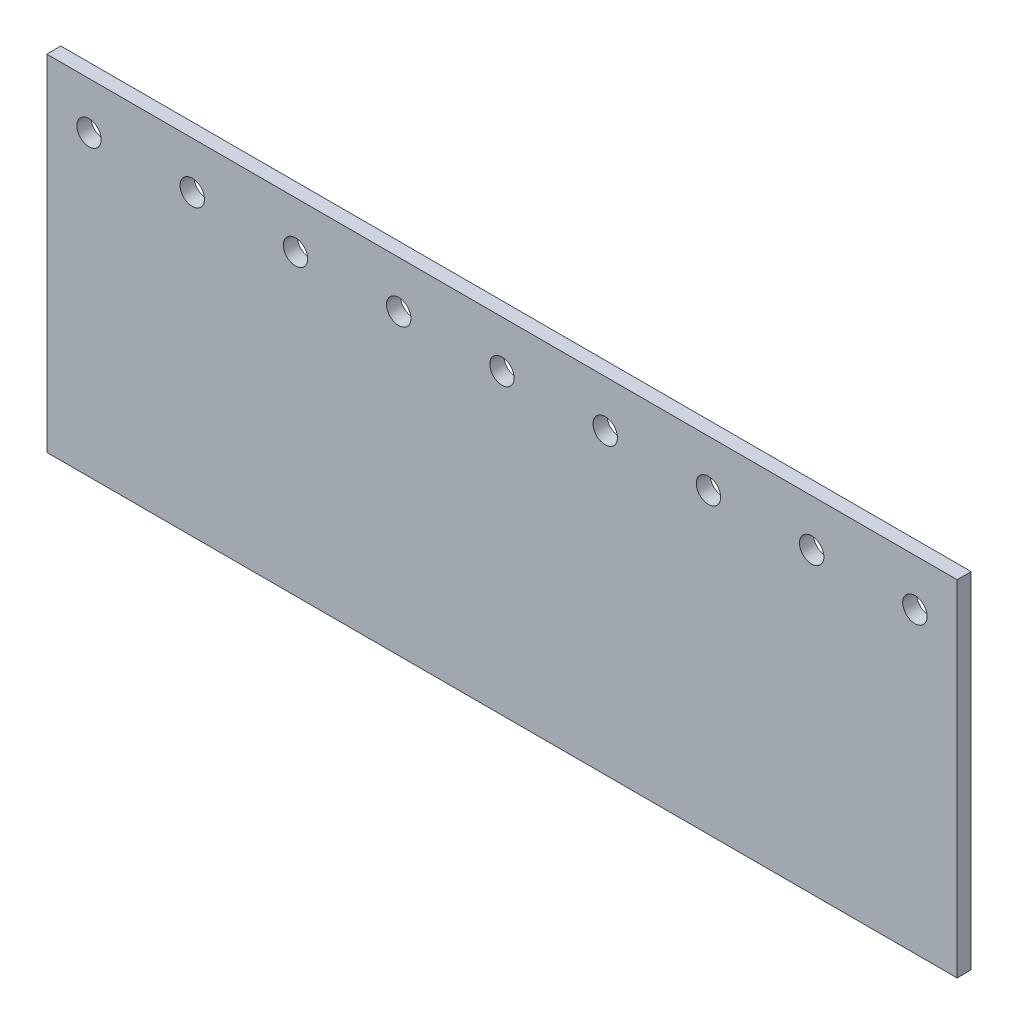
ISO-10303-21;
HEADER;
FILE_DESCRIPTION(('STEP AP214'),'2;1');
FILE_NAME('part.step','',(''),(''),'','','');
FILE_SCHEMA(('AUTOMOTIVE_DESIGN { 1 0 10303 214 1 1 1 1 }'));
ENDSEC;
DATA;
#1=APPLICATION_CONTEXT('core data for automotive mechanical design processes');
#2=APPLICATION_PROTOCOL_DEFINITION('international standard','automotive_design',2000,#1);
#3=PRODUCT_CONTEXT('',#1,'mechanical');
#4=PRODUCT('Part','Part','',(#3));
#5=PRODUCT_RELATED_PRODUCT_CATEGORY('part','',(#4));
#6=PRODUCT_DEFINITION_FORMATION('','',#4);
#7=PRODUCT_DEFINITION_CONTEXT('part definition',#1,'design');
#8=PRODUCT_DEFINITION('design','',#6,#7);
#9=PRODUCT_DEFINITION_SHAPE('','',#8);
#10=(LENGTH_UNIT() NAMED_UNIT(*) SI_UNIT(.MILLI.,.METRE.));
#11=(NAMED_UNIT(*) PLANE_ANGLE_UNIT() SI_UNIT($,.RADIAN.));
#12=(NAMED_UNIT(*) SI_UNIT($,.STERADIAN.) SOLID_ANGLE_UNIT());
#13=UNCERTAINTY_MEASURE_WITH_UNIT(LENGTH_MEASURE(1.E-05),#10,'distance_accuracy_value','');
#14=(GEOMETRIC_REPRESENTATION_CONTEXT(3) GLOBAL_UNCERTAINTY_ASSIGNED_CONTEXT((#13)) GLOBAL_UNIT_ASSIGNED_CONTEXT((#10,
#11,#12)) REPRESENTATION_CONTEXT('',''));
#15=CARTESIAN_POINT('',(0.,0.,0.));
#16=DIRECTION('',(0.,0.,1.));
#17=DIRECTION('',(1.,0.,0.));
#18=AXIS2_PLACEMENT_3D('',#15,#16,#17);
#19=CARTESIAN_POINT('',(-100.,36.75,3.));
#20=DIRECTION('',(0.,-1.,0.));
#21=DIRECTION('',(0.,0.,-1.));
#22=AXIS2_PLACEMENT_3D('',#19,#20,#21);
#23=PLANE('',#22);
#24=DIRECTION('',(-1.,0.,0.));
#25=VECTOR('',#24,1.);
#26=CARTESIAN_POINT('',(-100.,36.75,0.));
#27=LINE('',#26,#25);
#28=CARTESIAN_POINT('',(97.,36.75,0.));
#29=VERTEX_POINT('',#28);
#30=CARTESIAN_POINT('',(-97.,36.75,0.));
#31=VERTEX_POINT('',#30);
#32=EDGE_CURVE('E94',#29,#31,#27,.T.);
#33=ORIENTED_EDGE('',*,*,#32,.T.);
#34=DIRECTION('',(0.,0.,1.));
#35=VECTOR('',#34,1.);
#36=CARTESIAN_POINT('',(-97.,36.75,0.));
#37=LINE('',#36,#35);
#38=CARTESIAN_POINT('',(-97.,36.75,3.));
#39=VERTEX_POINT('',#38);
#40=EDGE_CURVE('E54',#31,#39,#37,.T.);
#41=ORIENTED_EDGE('',*,*,#40,.T.);
#42=DIRECTION('',(-1.,0.,0.));
#43=VECTOR('',#42,1.);
#44=CARTESIAN_POINT('',(-100.,36.75,3.));
#45=LINE('',#44,#43);
#46=CARTESIAN_POINT('',(97.,36.75,3.));
#47=VERTEX_POINT('',#46);
#48=EDGE_CURVE('E46',#47,#39,#45,.T.);
#49=ORIENTED_EDGE('',*,*,#48,.F.);
#50=DIRECTION('',(0.,0.,1.));
#51=VECTOR('',#50,1.);
#52=CARTESIAN_POINT('',(97.,36.75,0.));
#53=LINE('',#52,#51);
#54=EDGE_CURVE('E158',#29,#47,#53,.T.);
#55=ORIENTED_EDGE('',*,*,#54,.F.);
#56=EDGE_LOOP('',(#33,#41,#49,#55));
#57=FACE_BOUND('',#56,.T.);
#58=ADVANCED_FACE('F38',(#57),#23,.F.);
#59=CARTESIAN_POINT('',(-100.,-36.75,3.));
#60=DIRECTION('',(0.,1.,0.));
#61=DIRECTION('',(0.,0.,1.));
#62=AXIS2_PLACEMENT_3D('',#59,#60,#61);
#63=PLANE('',#62);
#64=DIRECTION('',(1.,0.,0.));
#65=VECTOR('',#64,1.);
#66=CARTESIAN_POINT('',(-100.,-36.75,3.));
#67=LINE('',#66,#65);
#68=CARTESIAN_POINT('',(-97.,-36.75,3.));
#69=VERTEX_POINT('',#68);
#70=CARTESIAN_POINT('',(97.,-36.75,3.));
#71=VERTEX_POINT('',#70);
#72=EDGE_CURVE('E11',#69,#71,#67,.T.);
#73=ORIENTED_EDGE('',*,*,#72,.F.);
#74=DIRECTION('',(0.,0.,1.));
#75=VECTOR('',#74,1.);
#76=CARTESIAN_POINT('',(-97.,-36.75,0.));
#77=LINE('',#76,#75);
#78=CARTESIAN_POINT('',(-97.,-36.75,0.));
#79=VERTEX_POINT('',#78);
#80=EDGE_CURVE('E80',#79,#69,#77,.T.);
#81=ORIENTED_EDGE('',*,*,#80,.F.);
#82=DIRECTION('',(1.,0.,0.));
#83=VECTOR('',#82,1.);
#84=CARTESIAN_POINT('',(-100.,-36.75,0.));
#85=LINE('',#84,#83);
#86=CARTESIAN_POINT('',(97.,-36.75,0.));
#87=VERTEX_POINT('',#86);
#88=EDGE_CURVE('E41',#79,#87,#85,.T.);
#89=ORIENTED_EDGE('',*,*,#88,.T.);
#90=DIRECTION('',(0.,0.,1.));
#91=VECTOR('',#90,1.);
#92=CARTESIAN_POINT('',(97.,-36.75,0.));
#93=LINE('',#92,#91);
#94=EDGE_CURVE('E62',#87,#71,#93,.T.);
#95=ORIENTED_EDGE('',*,*,#94,.T.);
#96=EDGE_LOOP('',(#73,#81,#89,#95));
#97=FACE_BOUND('',#96,.T.);
#98=ADVANCED_FACE('F90',(#97),#63,.F.);
#99=CARTESIAN_POINT('',(0.,0.,3.));
#100=DIRECTION('',(0.,0.,1.));
#101=DIRECTION('',(1.,0.,0.));
#102=AXIS2_PLACEMENT_3D('',#99,#100,#101);
#103=PLANE('',#102);
#104=DIRECTION('',(0.,1.,0.));
#105=VECTOR('',#104,1.);
#106=CARTESIAN_POINT('',(-97.,0.,3.));
#107=LINE('',#106,#105);
#108=EDGE_CURVE('E144',#69,#39,#107,.T.);
#109=ORIENTED_EDGE('',*,*,#108,.F.);
#110=ORIENTED_EDGE('',*,*,#72,.T.);
#111=DIRECTION('',(0.,-1.,0.));
#112=VECTOR('',#111,1.);
#113=CARTESIAN_POINT('',(97.,0.,3.));
#114=LINE('',#113,#112);
#115=EDGE_CURVE('E156',#47,#71,#114,.T.);
#116=ORIENTED_EDGE('',*,*,#115,.F.);
#117=ORIENTED_EDGE('',*,*,#48,.T.);
#118=EDGE_LOOP('',(#109,#110,#116,#117));
#119=FACE_BOUND('',#118,.T.);
#120=CARTESIAN_POINT('',(-22.,26.75,3.));
#121=DIRECTION('',(0.,0.,1.));
#122=DIRECTION('',(1.,0.,0.));
#123=AXIS2_PLACEMENT_3D('',#120,#121,#122);
#124=CIRCLE('',#123,2.6);
#125=CARTESIAN_POINT('',(-19.4,26.75,3.));
#126=VERTEX_POINT('',#125);
#127=EDGE_CURVE('E129',#126,#126,#124,.T.);
#128=ORIENTED_EDGE('',*,*,#127,.F.);
#129=EDGE_LOOP('',(#128));
#130=FACE_BOUND('',#129,.T.);
#131=CARTESIAN_POINT('',(88.,26.75,3.));
#132=DIRECTION('',(0.,0.,1.));
#133=DIRECTION('',(1.,0.,0.));
#134=AXIS2_PLACEMENT_3D('',#131,#132,#133);
#135=CIRCLE('',#134,2.6);
#136=CARTESIAN_POINT('',(90.6,26.75,3.));
#137=VERTEX_POINT('',#136);
#138=EDGE_CURVE('E128',#137,#137,#135,.T.);
#139=ORIENTED_EDGE('',*,*,#138,.F.);
#140=EDGE_LOOP('',(#139));
#141=FACE_BOUND('',#140,.T.);
#142=CARTESIAN_POINT('',(66.,26.75,3.));
#143=DIRECTION('',(0.,0.,1.));
#144=DIRECTION('',(1.,0.,0.));
#145=AXIS2_PLACEMENT_3D('',#142,#143,#144);
#146=CIRCLE('',#145,2.6);
#147=CARTESIAN_POINT('',(68.6,26.75,3.));
#148=VERTEX_POINT('',#147);
#149=EDGE_CURVE('E117',#148,#148,#146,.T.);
#150=ORIENTED_EDGE('',*,*,#149,.F.);
#151=EDGE_LOOP('',(#150));
#152=FACE_BOUND('',#151,.T.);
#153=CARTESIAN_POINT('',(44.,26.75,3.));
#154=DIRECTION('',(0.,0.,1.));
#155=DIRECTION('',(1.,0.,0.));
#156=AXIS2_PLACEMENT_3D('',#153,#154,#155);
#157=CIRCLE('',#156,2.6);
#158=CARTESIAN_POINT('',(46.6,26.75,3.));
#159=VERTEX_POINT('',#158);
#160=EDGE_CURVE('E116',#159,#159,#157,.T.);
#161=ORIENTED_EDGE('',*,*,#160,.F.);
#162=EDGE_LOOP('',(#161));
#163=FACE_BOUND('',#162,.T.);
#164=CARTESIAN_POINT('',(-44.,26.75,3.));
#165=DIRECTION('',(0.,0.,1.));
#166=DIRECTION('',(1.,0.,0.));
#167=AXIS2_PLACEMENT_3D('',#164,#165,#166);
#168=CIRCLE('',#167,2.6);
#169=CARTESIAN_POINT('',(-41.4,26.75,3.));
#170=VERTEX_POINT('',#169);
#171=EDGE_CURVE('E148',#170,#170,#168,.T.);
#172=ORIENTED_EDGE('',*,*,#171,.F.);
#173=EDGE_LOOP('',(#172));
#174=FACE_BOUND('',#173,.T.);
#175=CARTESIAN_POINT('',(-66.,26.75,3.));
#176=DIRECTION('',(0.,0.,1.));
#177=DIRECTION('',(1.,0.,0.));
#178=AXIS2_PLACEMENT_3D('',#175,#176,#177);
#179=CIRCLE('',#178,2.6);
#180=CARTESIAN_POINT('',(-63.4,26.75,3.));
#181=VERTEX_POINT('',#180);
#182=EDGE_CURVE('E140',#181,#181,#179,.T.);
#183=ORIENTED_EDGE('',*,*,#182,.F.);
#184=EDGE_LOOP('',(#183));
#185=FACE_BOUND('',#184,.T.);
#186=CARTESIAN_POINT('',(-88.,26.75,3.));
#187=DIRECTION('',(0.,0.,1.));
#188=DIRECTION('',(1.,0.,0.));
#189=AXIS2_PLACEMENT_3D('',#186,#187,#188);
#190=CIRCLE('',#189,2.6);
#191=CARTESIAN_POINT('',(-85.4,26.75,3.));
#192=VERTEX_POINT('',#191);
#193=EDGE_CURVE('E141',#192,#192,#190,.T.);
#194=ORIENTED_EDGE('',*,*,#193,.F.);
#195=EDGE_LOOP('',(#194));
#196=FACE_BOUND('',#195,.T.);
#197=CARTESIAN_POINT('',(22.,26.75,3.));
#198=DIRECTION('',(0.,0.,1.));
#199=DIRECTION('',(1.,0.,0.));
#200=AXIS2_PLACEMENT_3D('',#197,#198,#199);
#201=CIRCLE('',#200,2.6);
#202=CARTESIAN_POINT('',(24.6,26.75,3.));
#203=VERTEX_POINT('',#202);
#204=EDGE_CURVE('E109',#203,#203,#201,.T.);
#205=ORIENTED_EDGE('',*,*,#204,.F.);
#206=EDGE_LOOP('',(#205));
#207=FACE_BOUND('',#206,.T.);
#208=CARTESIAN_POINT('',(0.,26.75,3.));
#209=DIRECTION('',(0.,0.,1.));
#210=DIRECTION('',(1.,0.,0.));
#211=AXIS2_PLACEMENT_3D('',#208,#209,#210);
#212=CIRCLE('',#211,2.6);
#213=CARTESIAN_POINT('',(2.59999999999997,26.75,3.));
#214=VERTEX_POINT('',#213);
#215=EDGE_CURVE('E97',#214,#214,#212,.T.);
#216=ORIENTED_EDGE('',*,*,#215,.F.);
#217=EDGE_LOOP('',(#216));
#218=FACE_BOUND('',#217,.T.);
#219=ADVANCED_FACE('F165',(#119,#130,#141,#152,#163,#174,#185,#196,#207,#218),#103,.T.);
#220=CARTESIAN_POINT('',(0.,0.,0.));
#221=DIRECTION('',(0.,0.,1.));
#222=DIRECTION('',(1.,0.,0.));
#223=AXIS2_PLACEMENT_3D('',#220,#221,#222);
#224=PLANE('',#223);
#225=CARTESIAN_POINT('',(-22.,26.75,0.));
#226=DIRECTION('',(0.,0.,1.));
#227=DIRECTION('',(1.,0.,0.));
#228=AXIS2_PLACEMENT_3D('',#225,#226,#227);
#229=CIRCLE('',#228,2.6);
#230=CARTESIAN_POINT('',(-19.4,26.75,0.));
#231=VERTEX_POINT('',#230);
#232=EDGE_CURVE('E125',#231,#231,#229,.T.);
#233=ORIENTED_EDGE('',*,*,#232,.T.);
#234=EDGE_LOOP('',(#233));
#235=FACE_BOUND('',#234,.T.);
#236=CARTESIAN_POINT('',(88.,26.75,0.));
#237=DIRECTION('',(0.,0.,1.));
#238=DIRECTION('',(1.,0.,0.));
#239=AXIS2_PLACEMENT_3D('',#236,#237,#238);
#240=CIRCLE('',#239,2.6);
#241=CARTESIAN_POINT('',(90.6,26.75,0.));
#242=VERTEX_POINT('',#241);
#243=EDGE_CURVE('E120',#242,#242,#240,.T.);
#244=ORIENTED_EDGE('',*,*,#243,.T.);
#245=EDGE_LOOP('',(#244));
#246=FACE_BOUND('',#245,.T.);
#247=CARTESIAN_POINT('',(66.,26.75,0.));
#248=DIRECTION('',(0.,0.,1.));
#249=DIRECTION('',(1.,0.,0.));
#250=AXIS2_PLACEMENT_3D('',#247,#248,#249);
#251=CIRCLE('',#250,2.6);
#252=CARTESIAN_POINT('',(68.6,26.75,0.));
#253=VERTEX_POINT('',#252);
#254=EDGE_CURVE('E113',#253,#253,#251,.T.);
#255=ORIENTED_EDGE('',*,*,#254,.T.);
#256=EDGE_LOOP('',(#255));
#257=FACE_BOUND('',#256,.T.);
#258=CARTESIAN_POINT('',(44.,26.75,0.));
#259=DIRECTION('',(0.,0.,1.));
#260=DIRECTION('',(1.,0.,0.));
#261=AXIS2_PLACEMENT_3D('',#258,#259,#260);
#262=CIRCLE('',#261,2.6);
#263=CARTESIAN_POINT('',(46.6,26.75,0.));
#264=VERTEX_POINT('',#263);
#265=EDGE_CURVE('E112',#264,#264,#262,.T.);
#266=ORIENTED_EDGE('',*,*,#265,.T.);
#267=EDGE_LOOP('',(#266));
#268=FACE_BOUND('',#267,.T.);
#269=CARTESIAN_POINT('',(-44.,26.75,0.));
#270=DIRECTION('',(0.,0.,1.));
#271=DIRECTION('',(1.,0.,0.));
#272=AXIS2_PLACEMENT_3D('',#269,#270,#271);
#273=CIRCLE('',#272,2.6);
#274=CARTESIAN_POINT('',(-41.4,26.75,0.));
#275=VERTEX_POINT('',#274);
#276=EDGE_CURVE('E132',#275,#275,#273,.T.);
#277=ORIENTED_EDGE('',*,*,#276,.T.);
#278=EDGE_LOOP('',(#277));
#279=FACE_BOUND('',#278,.T.);
#280=CARTESIAN_POINT('',(-66.,26.75,0.));
#281=DIRECTION('',(0.,0.,1.));
#282=DIRECTION('',(1.,0.,0.));
#283=AXIS2_PLACEMENT_3D('',#280,#281,#282);
#284=CIRCLE('',#283,2.6);
#285=CARTESIAN_POINT('',(-63.4,26.75,0.));
#286=VERTEX_POINT('',#285);
#287=EDGE_CURVE('E145',#286,#286,#284,.T.);
#288=ORIENTED_EDGE('',*,*,#287,.T.);
#289=EDGE_LOOP('',(#288));
#290=FACE_BOUND('',#289,.T.);
#291=CARTESIAN_POINT('',(-88.,26.75,0.));
#292=DIRECTION('',(0.,0.,1.));
#293=DIRECTION('',(1.,0.,0.));
#294=AXIS2_PLACEMENT_3D('',#291,#292,#293);
#295=CIRCLE('',#294,2.6);
#296=CARTESIAN_POINT('',(-85.4,26.75,0.));
#297=VERTEX_POINT('',#296);
#298=EDGE_CURVE('E137',#297,#297,#295,.T.);
#299=ORIENTED_EDGE('',*,*,#298,.T.);
#300=EDGE_LOOP('',(#299));
#301=FACE_BOUND('',#300,.T.);
#302=CARTESIAN_POINT('',(22.,26.75,0.));
#303=DIRECTION('',(0.,0.,1.));
#304=DIRECTION('',(1.,0.,0.));
#305=AXIS2_PLACEMENT_3D('',#302,#303,#304);
#306=CIRCLE('',#305,2.6);
#307=CARTESIAN_POINT('',(24.6,26.75,0.));
#308=VERTEX_POINT('',#307);
#309=EDGE_CURVE('E106',#308,#308,#306,.T.);
#310=ORIENTED_EDGE('',*,*,#309,.T.);
#311=EDGE_LOOP('',(#310));
#312=FACE_BOUND('',#311,.T.);
#313=CARTESIAN_POINT('',(0.,26.75,0.));
#314=DIRECTION('',(0.,0.,1.));
#315=DIRECTION('',(1.,0.,0.));
#316=AXIS2_PLACEMENT_3D('',#313,#314,#315);
#317=CIRCLE('',#316,2.6);
#318=CARTESIAN_POINT('',(2.59999999999997,26.75,0.));
#319=VERTEX_POINT('',#318);
#320=EDGE_CURVE('E101',#319,#319,#317,.T.);
#321=ORIENTED_EDGE('',*,*,#320,.T.);
#322=EDGE_LOOP('',(#321));
#323=FACE_BOUND('',#322,.T.);
#324=ORIENTED_EDGE('',*,*,#88,.F.);
#325=DIRECTION('',(0.,1.,0.));
#326=VECTOR('',#325,1.);
#327=CARTESIAN_POINT('',(-97.,36.75,0.));
#328=LINE('',#327,#326);
#329=EDGE_CURVE('E77',#79,#31,#328,.T.);
#330=ORIENTED_EDGE('',*,*,#329,.T.);
#331=ORIENTED_EDGE('',*,*,#32,.F.);
#332=DIRECTION('',(0.,-1.,0.));
#333=VECTOR('',#332,1.);
#334=CARTESIAN_POINT('',(97.,36.75,0.));
#335=LINE('',#334,#333);
#336=EDGE_CURVE('E93',#29,#87,#335,.T.);
#337=ORIENTED_EDGE('',*,*,#336,.T.);
#338=EDGE_LOOP('',(#324,#330,#331,#337));
#339=FACE_BOUND('',#338,.T.);
#340=ADVANCED_FACE('F92',(#235,#246,#257,#268,#279,#290,#301,#312,#323,#339),#224,.F.);
#341=CARTESIAN_POINT('',(0.,26.75,0.));
#342=DIRECTION('',(0.,0.,1.));
#343=DIRECTION('',(1.,0.,0.));
#344=AXIS2_PLACEMENT_3D('',#341,#342,#343);
#345=CYLINDRICAL_SURFACE('',#344,2.6);
#346=ORIENTED_EDGE('',*,*,#215,.T.);
#347=EDGE_LOOP('',(#346));
#348=FACE_BOUND('',#347,.T.);
#349=ORIENTED_EDGE('',*,*,#320,.F.);
#350=EDGE_LOOP('',(#349));
#351=FACE_BOUND('',#350,.T.);
#352=ADVANCED_FACE('F191',(#348,#351),#345,.F.);
#353=CARTESIAN_POINT('',(22.,26.75,0.));
#354=DIRECTION('',(0.,0.,1.));
#355=DIRECTION('',(1.,0.,0.));
#356=AXIS2_PLACEMENT_3D('',#353,#354,#355);
#357=CYLINDRICAL_SURFACE('',#356,2.6);
#358=ORIENTED_EDGE('',*,*,#204,.T.);
#359=EDGE_LOOP('',(#358));
#360=FACE_BOUND('',#359,.T.);
#361=ORIENTED_EDGE('',*,*,#309,.F.);
#362=EDGE_LOOP('',(#361));
#363=FACE_BOUND('',#362,.T.);
#364=ADVANCED_FACE('F196',(#360,#363),#357,.F.);
#365=CARTESIAN_POINT('',(-88.,26.75,0.));
#366=DIRECTION('',(0.,0.,1.));
#367=DIRECTION('',(1.,0.,0.));
#368=AXIS2_PLACEMENT_3D('',#365,#366,#367);
#369=CYLINDRICAL_SURFACE('',#368,2.6);
#370=ORIENTED_EDGE('',*,*,#193,.T.);
#371=EDGE_LOOP('',(#370));
#372=FACE_BOUND('',#371,.T.);
#373=ORIENTED_EDGE('',*,*,#298,.F.);
#374=EDGE_LOOP('',(#373));
#375=FACE_BOUND('',#374,.T.);
#376=ADVANCED_FACE('F200',(#372,#375),#369,.F.);
#377=CARTESIAN_POINT('',(-66.,26.75,0.));
#378=DIRECTION('',(0.,0.,1.));
#379=DIRECTION('',(1.,0.,0.));
#380=AXIS2_PLACEMENT_3D('',#377,#378,#379);
#381=CYLINDRICAL_SURFACE('',#380,2.6);
#382=ORIENTED_EDGE('',*,*,#182,.T.);
#383=EDGE_LOOP('',(#382));
#384=FACE_BOUND('',#383,.T.);
#385=ORIENTED_EDGE('',*,*,#287,.F.);
#386=EDGE_LOOP('',(#385));
#387=FACE_BOUND('',#386,.T.);
#388=ADVANCED_FACE('F216',(#384,#387),#381,.F.);
#389=CARTESIAN_POINT('',(-44.,26.75,0.));
#390=DIRECTION('',(0.,0.,1.));
#391=DIRECTION('',(1.,0.,0.));
#392=AXIS2_PLACEMENT_3D('',#389,#390,#391);
#393=CYLINDRICAL_SURFACE('',#392,2.6);
#394=ORIENTED_EDGE('',*,*,#171,.T.);
#395=EDGE_LOOP('',(#394));
#396=FACE_BOUND('',#395,.T.);
#397=ORIENTED_EDGE('',*,*,#276,.F.);
#398=EDGE_LOOP('',(#397));
#399=FACE_BOUND('',#398,.T.);
#400=ADVANCED_FACE('F208',(#396,#399),#393,.F.);
#401=CARTESIAN_POINT('',(44.,26.75,0.));
#402=DIRECTION('',(0.,0.,1.));
#403=DIRECTION('',(1.,0.,0.));
#404=AXIS2_PLACEMENT_3D('',#401,#402,#403);
#405=CYLINDRICAL_SURFACE('',#404,2.6);
#406=ORIENTED_EDGE('',*,*,#160,.T.);
#407=EDGE_LOOP('',(#406));
#408=FACE_BOUND('',#407,.T.);
#409=ORIENTED_EDGE('',*,*,#265,.F.);
#410=EDGE_LOOP('',(#409));
#411=FACE_BOUND('',#410,.T.);
#412=ADVANCED_FACE('F205',(#408,#411),#405,.F.);
#413=CARTESIAN_POINT('',(66.,26.75,0.));
#414=DIRECTION('',(0.,0.,1.));
#415=DIRECTION('',(1.,0.,0.));
#416=AXIS2_PLACEMENT_3D('',#413,#414,#415);
#417=CYLINDRICAL_SURFACE('',#416,2.6);
#418=ORIENTED_EDGE('',*,*,#149,.T.);
#419=EDGE_LOOP('',(#418));
#420=FACE_BOUND('',#419,.T.);
#421=ORIENTED_EDGE('',*,*,#254,.F.);
#422=EDGE_LOOP('',(#421));
#423=FACE_BOUND('',#422,.T.);
#424=ADVANCED_FACE('F202',(#420,#423),#417,.F.);
#425=CARTESIAN_POINT('',(88.,26.75,0.));
#426=DIRECTION('',(0.,0.,1.));
#427=DIRECTION('',(1.,0.,0.));
#428=AXIS2_PLACEMENT_3D('',#425,#426,#427);
#429=CYLINDRICAL_SURFACE('',#428,2.6);
#430=ORIENTED_EDGE('',*,*,#138,.T.);
#431=EDGE_LOOP('',(#430));
#432=FACE_BOUND('',#431,.T.);
#433=ORIENTED_EDGE('',*,*,#243,.F.);
#434=EDGE_LOOP('',(#433));
#435=FACE_BOUND('',#434,.T.);
#436=ADVANCED_FACE('F176',(#432,#435),#429,.F.);
#437=CARTESIAN_POINT('',(-22.,26.75,0.));
#438=DIRECTION('',(0.,0.,1.));
#439=DIRECTION('',(1.,0.,0.));
#440=AXIS2_PLACEMENT_3D('',#437,#438,#439);
#441=CYLINDRICAL_SURFACE('',#440,2.6);
#442=ORIENTED_EDGE('',*,*,#127,.T.);
#443=EDGE_LOOP('',(#442));
#444=FACE_BOUND('',#443,.T.);
#445=ORIENTED_EDGE('',*,*,#232,.F.);
#446=EDGE_LOOP('',(#445));
#447=FACE_BOUND('',#446,.T.);
#448=ADVANCED_FACE('F169',(#444,#447),#441,.F.);
#449=CARTESIAN_POINT('',(97.,36.75,0.));
#450=DIRECTION('',(-1.,0.,0.));
#451=DIRECTION('',(0.,0.,1.));
#452=AXIS2_PLACEMENT_3D('',#449,#450,#451);
#453=PLANE('',#452);
#454=ORIENTED_EDGE('',*,*,#115,.T.);
#455=ORIENTED_EDGE('',*,*,#94,.F.);
#456=ORIENTED_EDGE('',*,*,#336,.F.);
#457=ORIENTED_EDGE('',*,*,#54,.T.);
#458=EDGE_LOOP('',(#454,#455,#456,#457));
#459=FACE_BOUND('',#458,.T.);
#460=ADVANCED_FACE('F167',(#459),#453,.F.);
#461=CARTESIAN_POINT('',(-97.,36.75,0.));
#462=DIRECTION('',(1.,0.,0.));
#463=DIRECTION('',(0.,0.,-1.));
#464=AXIS2_PLACEMENT_3D('',#461,#462,#463);
#465=PLANE('',#464);
#466=ORIENTED_EDGE('',*,*,#108,.T.);
#467=ORIENTED_EDGE('',*,*,#40,.F.);
#468=ORIENTED_EDGE('',*,*,#329,.F.);
#469=ORIENTED_EDGE('',*,*,#80,.T.);
#470=EDGE_LOOP('',(#466,#467,#468,#469));
#471=FACE_BOUND('',#470,.T.);
#472=ADVANCED_FACE('F79',(#471),#465,.F.);
#473=CLOSED_SHELL('',(#58,#98,#219,#340,#352,#364,#376,#388,#400,#412,#424,#436,#448,#460,#472));
#474=MANIFOLD_SOLID_BREP('B2',#473);
#475=ADVANCED_BREP_SHAPE_REPRESENTATION('',(#18,#474),#14);
#476=SHAPE_DEFINITION_REPRESENTATION(#9,#475);
ENDSEC;
END-ISO-10303-21;
